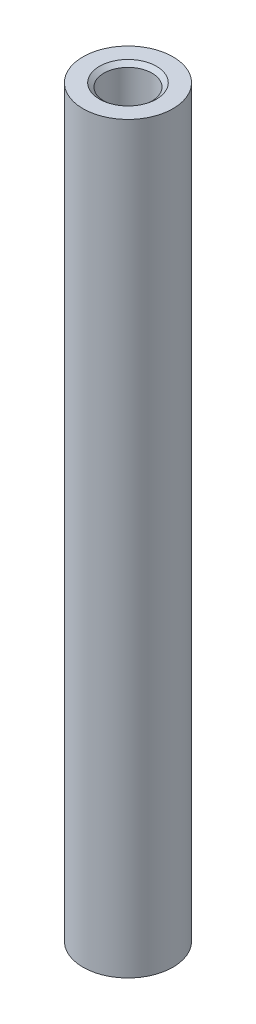
ISO-10303-21;
HEADER;
FILE_DESCRIPTION(('STEP AP214'),'2;1');
FILE_NAME('part.step','',(''),(''),'','','');
FILE_SCHEMA(('AUTOMOTIVE_DESIGN { 1 0 10303 214 1 1 1 1 }'));
ENDSEC;
DATA;
#1=APPLICATION_CONTEXT('core data for automotive mechanical design processes');
#2=APPLICATION_PROTOCOL_DEFINITION('international standard','automotive_design',2000,#1);
#3=PRODUCT_CONTEXT('',#1,'mechanical');
#4=PRODUCT('Part','Part','',(#3));
#5=PRODUCT_RELATED_PRODUCT_CATEGORY('part','',(#4));
#6=PRODUCT_DEFINITION_FORMATION('','',#4);
#7=PRODUCT_DEFINITION_CONTEXT('part definition',#1,'design');
#8=PRODUCT_DEFINITION('design','',#6,#7);
#9=PRODUCT_DEFINITION_SHAPE('','',#8);
#10=(LENGTH_UNIT() NAMED_UNIT(*) SI_UNIT(.MILLI.,.METRE.));
#11=(NAMED_UNIT(*) PLANE_ANGLE_UNIT() SI_UNIT($,.RADIAN.));
#12=(NAMED_UNIT(*) SI_UNIT($,.STERADIAN.) SOLID_ANGLE_UNIT());
#13=UNCERTAINTY_MEASURE_WITH_UNIT(LENGTH_MEASURE(1.E-05),#10,'distance_accuracy_value','');
#14=(GEOMETRIC_REPRESENTATION_CONTEXT(3) GLOBAL_UNCERTAINTY_ASSIGNED_CONTEXT((#13)) GLOBAL_UNIT_ASSIGNED_CONTEXT((#10,
#11,#12)) REPRESENTATION_CONTEXT('',''));
#15=CARTESIAN_POINT('',(0.,0.,0.));
#16=DIRECTION('',(0.,0.,1.));
#17=DIRECTION('',(1.,0.,0.));
#18=AXIS2_PLACEMENT_3D('',#15,#16,#17);
#19=CARTESIAN_POINT('',(0.,104.9782,0.));
#20=DIRECTION('',(0.,-1.,0.));
#21=DIRECTION('',(0.,0.,-1.));
#22=AXIS2_PLACEMENT_3D('',#19,#20,#21);
#23=CYLINDRICAL_SURFACE('',#22,6.35);
#24=CARTESIAN_POINT('',(0.,104.9782,0.));
#25=DIRECTION('',(0.,1.,0.));
#26=DIRECTION('',(0.,0.,1.));
#27=AXIS2_PLACEMENT_3D('',#24,#25,#26);
#28=CIRCLE('',#27,6.35);
#29=CARTESIAN_POINT('',(0.,104.9782,6.35));
#30=VERTEX_POINT('',#29);
#31=EDGE_CURVE('E11',#30,#30,#28,.T.);
#32=ORIENTED_EDGE('',*,*,#31,.F.);
#33=EDGE_LOOP('',(#32));
#34=FACE_BOUND('',#33,.T.);
#35=CARTESIAN_POINT('',(0.,0.,0.));
#36=DIRECTION('',(0.,1.,0.));
#37=DIRECTION('',(0.,0.,1.));
#38=AXIS2_PLACEMENT_3D('',#35,#36,#37);
#39=CIRCLE('',#38,6.35);
#40=CARTESIAN_POINT('',(0.,0.,6.35));
#41=VERTEX_POINT('',#40);
#42=EDGE_CURVE('E50',#41,#41,#39,.T.);
#43=ORIENTED_EDGE('',*,*,#42,.T.);
#44=EDGE_LOOP('',(#43));
#45=FACE_BOUND('',#44,.T.);
#46=ADVANCED_FACE('F47',(#34,#45),#23,.T.);
#47=CARTESIAN_POINT('',(0.,104.9782,0.));
#48=DIRECTION('',(0.,1.,0.));
#49=DIRECTION('',(0.,0.,1.));
#50=AXIS2_PLACEMENT_3D('',#47,#48,#49);
#51=PLANE('',#50);
#52=CARTESIAN_POINT('',(0.,104.9782,0.));
#53=DIRECTION('',(0.,1.,0.));
#54=DIRECTION('',(0.,0.,1.));
#55=AXIS2_PLACEMENT_3D('',#52,#53,#54);
#56=CIRCLE('',#55,4.025);
#57=CARTESIAN_POINT('',(0.,104.9782,4.025));
#58=VERTEX_POINT('',#57);
#59=EDGE_CURVE('E72',#58,#58,#56,.T.);
#60=ORIENTED_EDGE('',*,*,#59,.F.);
#61=EDGE_LOOP('',(#60));
#62=FACE_BOUND('',#61,.T.);
#63=ORIENTED_EDGE('',*,*,#31,.T.);
#64=EDGE_LOOP('',(#63));
#65=FACE_BOUND('',#64,.T.);
#66=ADVANCED_FACE('F101',(#62,#65),#51,.T.);
#67=CARTESIAN_POINT('',(0.,0.,0.));
#68=DIRECTION('',(0.,1.,0.));
#69=DIRECTION('',(0.,0.,1.));
#70=AXIS2_PLACEMENT_3D('',#67,#68,#69);
#71=PLANE('',#70);
#72=CARTESIAN_POINT('',(0.,0.,0.));
#73=DIRECTION('',(0.,-1.,0.));
#74=DIRECTION('',(0.,0.,-1.));
#75=AXIS2_PLACEMENT_3D('',#72,#73,#74);
#76=CIRCLE('',#75,3.81);
#77=CARTESIAN_POINT('',(0.,0.,-3.81));
#78=VERTEX_POINT('',#77);
#79=EDGE_CURVE('E81',#78,#78,#76,.T.);
#80=ORIENTED_EDGE('',*,*,#79,.F.);
#81=EDGE_LOOP('',(#80));
#82=FACE_BOUND('',#81,.T.);
#83=ORIENTED_EDGE('',*,*,#42,.F.);
#84=EDGE_LOOP('',(#83));
#85=FACE_BOUND('',#84,.T.);
#86=ADVANCED_FACE('F98',(#82,#85),#71,.F.);
#87=CARTESIAN_POINT('',(0.,85.217,0.));
#88=DIRECTION('',(0.,1.,0.));
#89=DIRECTION('',(0.,0.,1.));
#90=AXIS2_PLACEMENT_3D('',#87,#88,#89);
#91=CONICAL_SURFACE('',#90,3.39999999999998,1.02974425867665);
#92=CARTESIAN_POINT('',(0.,83.1740738953063,0.));
#93=VERTEX_POINT('',#92);
#94=VERTEX_LOOP('',#93);
#95=FACE_BOUND('',#94,.T.);
#96=CARTESIAN_POINT('',(0.,85.217,0.));
#97=DIRECTION('',(0.,1.,0.));
#98=DIRECTION('',(0.,0.,1.));
#99=AXIS2_PLACEMENT_3D('',#96,#97,#98);
#100=CIRCLE('',#99,3.39999999999998);
#101=CARTESIAN_POINT('',(0.,85.217,3.39999999999998));
#102=VERTEX_POINT('',#101);
#103=EDGE_CURVE('E88',#102,#102,#100,.T.);
#104=ORIENTED_EDGE('',*,*,#103,.T.);
#105=EDGE_LOOP('',(#104));
#106=FACE_BOUND('',#105,.T.);
#107=ADVANCED_FACE('F100',(#95,#106),#91,.F.);
#108=CARTESIAN_POINT('',(0.,104.9782,0.));
#109=DIRECTION('',(0.,1.,0.));
#110=DIRECTION('',(0.,0.,1.));
#111=AXIS2_PLACEMENT_3D('',#108,#109,#110);
#112=CYLINDRICAL_SURFACE('',#111,3.39999999999999);
#113=ORIENTED_EDGE('',*,*,#103,.F.);
#114=EDGE_LOOP('',(#113));
#115=FACE_BOUND('',#114,.T.);
#116=CARTESIAN_POINT('',(0.,104.453762730514,0.));
#117=DIRECTION('',(0.,1.,0.));
#118=DIRECTION('',(0.,0.,1.));
#119=AXIS2_PLACEMENT_3D('',#116,#117,#118);
#120=CIRCLE('',#119,3.4);
#121=CARTESIAN_POINT('',(0.,104.453762730514,3.4));
#122=VERTEX_POINT('',#121);
#123=EDGE_CURVE('E78',#122,#122,#120,.T.);
#124=ORIENTED_EDGE('',*,*,#123,.T.);
#125=EDGE_LOOP('',(#124));
#126=FACE_BOUND('',#125,.T.);
#127=ADVANCED_FACE('F107',(#115,#126),#112,.F.);
#128=CARTESIAN_POINT('',(0.,104.9782,0.));
#129=DIRECTION('',(0.,1.,0.));
#130=DIRECTION('',(0.,0.,1.));
#131=AXIS2_PLACEMENT_3D('',#128,#129,#130);
#132=CONICAL_SURFACE('',#131,4.025,0.872664625997157);
#133=ORIENTED_EDGE('',*,*,#123,.F.);
#134=EDGE_LOOP('',(#133));
#135=FACE_BOUND('',#134,.T.);
#136=ORIENTED_EDGE('',*,*,#59,.T.);
#137=EDGE_LOOP('',(#136));
#138=FACE_BOUND('',#137,.T.);
#139=ADVANCED_FACE('F65',(#135,#138),#132,.F.);
#140=CARTESIAN_POINT('',(0.,16.51,0.));
#141=DIRECTION('',(0.,-1.,0.));
#142=DIRECTION('',(0.,0.,-1.));
#143=AXIS2_PLACEMENT_3D('',#140,#141,#142);
#144=CONICAL_SURFACE('',#143,2.5527,1.02974425867665);
#145=CARTESIAN_POINT('',(0.,18.0438169021917,0.));
#146=VERTEX_POINT('',#145);
#147=VERTEX_LOOP('',#146);
#148=FACE_BOUND('',#147,.T.);
#149=CARTESIAN_POINT('',(0.,16.51,0.));
#150=DIRECTION('',(0.,-1.,0.));
#151=DIRECTION('',(0.,0.,-1.));
#152=AXIS2_PLACEMENT_3D('',#149,#150,#151);
#153=CIRCLE('',#152,2.5527);
#154=CARTESIAN_POINT('',(0.,16.51,-2.5527));
#155=VERTEX_POINT('',#154);
#156=EDGE_CURVE('E69',#155,#155,#153,.T.);
#157=ORIENTED_EDGE('',*,*,#156,.T.);
#158=EDGE_LOOP('',(#157));
#159=FACE_BOUND('',#158,.T.);
#160=ADVANCED_FACE('F61',(#148,#159),#144,.F.);
#161=CARTESIAN_POINT('',(0.,0.,0.));
#162=DIRECTION('',(0.,-1.,0.));
#163=DIRECTION('',(0.,0.,-1.));
#164=AXIS2_PLACEMENT_3D('',#161,#162,#163);
#165=CYLINDRICAL_SURFACE('',#164,2.5527);
#166=ORIENTED_EDGE('',*,*,#156,.F.);
#167=EDGE_LOOP('',(#166));
#168=FACE_BOUND('',#167,.T.);
#169=CARTESIAN_POINT('',(0.,1.0549999662792,0.));
#170=DIRECTION('',(0.,-1.,0.));
#171=DIRECTION('',(0.,0.,-1.));
#172=AXIS2_PLACEMENT_3D('',#169,#170,#171);
#173=CIRCLE('',#172,2.5527);
#174=CARTESIAN_POINT('',(0.,1.0549999662792,-2.5527));
#175=VERTEX_POINT('',#174);
#176=EDGE_CURVE('E73',#175,#175,#173,.T.);
#177=ORIENTED_EDGE('',*,*,#176,.T.);
#178=EDGE_LOOP('',(#177));
#179=FACE_BOUND('',#178,.T.);
#180=ADVANCED_FACE('F64',(#168,#179),#165,.F.);
#181=CARTESIAN_POINT('',(0.,0.,0.));
#182=DIRECTION('',(0.,-1.,0.));
#183=DIRECTION('',(0.,0.,-1.));
#184=AXIS2_PLACEMENT_3D('',#181,#182,#183);
#185=CONICAL_SURFACE('',#184,3.81,0.872664625997164);
#186=ORIENTED_EDGE('',*,*,#176,.F.);
#187=EDGE_LOOP('',(#186));
#188=FACE_BOUND('',#187,.T.);
#189=ORIENTED_EDGE('',*,*,#79,.T.);
#190=EDGE_LOOP('',(#189));
#191=FACE_BOUND('',#190,.T.);
#192=ADVANCED_FACE('F175',(#188,#191),#185,.F.);
#193=CLOSED_SHELL('',(#46,#66,#86,#107,#127,#139,#160,#180,#192));
#194=MANIFOLD_SOLID_BREP('B2',#193);
#195=ADVANCED_BREP_SHAPE_REPRESENTATION('',(#18,#194),#14);
#196=SHAPE_DEFINITION_REPRESENTATION(#9,#195);
ENDSEC;
END-ISO-10303-21;
